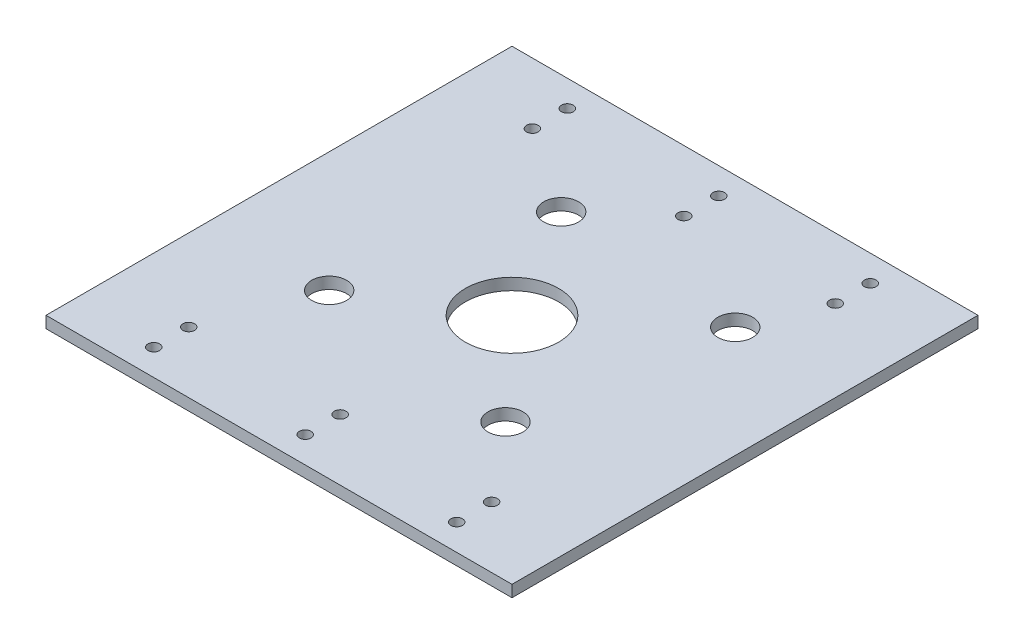
ISO-10303-21;
HEADER;
FILE_DESCRIPTION(('STEP AP214'),'2;1');
FILE_NAME('part.step','',(''),(''),'','','');
FILE_SCHEMA(('AUTOMOTIVE_DESIGN { 1 0 10303 214 1 1 1 1 }'));
ENDSEC;
DATA;
#1=APPLICATION_CONTEXT('core data for automotive mechanical design processes');
#2=APPLICATION_PROTOCOL_DEFINITION('international standard','automotive_design',2000,#1);
#3=PRODUCT_CONTEXT('',#1,'mechanical');
#4=PRODUCT('Part','Part','',(#3));
#5=PRODUCT_RELATED_PRODUCT_CATEGORY('part','',(#4));
#6=PRODUCT_DEFINITION_FORMATION('','',#4);
#7=PRODUCT_DEFINITION_CONTEXT('part definition',#1,'design');
#8=PRODUCT_DEFINITION('design','',#6,#7);
#9=PRODUCT_DEFINITION_SHAPE('','',#8);
#10=(LENGTH_UNIT() NAMED_UNIT(*) SI_UNIT(.MILLI.,.METRE.));
#11=(NAMED_UNIT(*) PLANE_ANGLE_UNIT() SI_UNIT($,.RADIAN.));
#12=(NAMED_UNIT(*) SI_UNIT($,.STERADIAN.) SOLID_ANGLE_UNIT());
#13=UNCERTAINTY_MEASURE_WITH_UNIT(LENGTH_MEASURE(1.E-05),#10,'distance_accuracy_value','');
#14=(GEOMETRIC_REPRESENTATION_CONTEXT(3) GLOBAL_UNCERTAINTY_ASSIGNED_CONTEXT((#13)) GLOBAL_UNIT_ASSIGNED_CONTEXT((#10,
#11,#12)) REPRESENTATION_CONTEXT('',''));
#15=CARTESIAN_POINT('',(0.,0.,0.));
#16=DIRECTION('',(0.,0.,1.));
#17=DIRECTION('',(1.,0.,0.));
#18=AXIS2_PLACEMENT_3D('',#15,#16,#17);
#19=CARTESIAN_POINT('',(0.,5.,0.));
#20=DIRECTION('',(0.,-1.,0.));
#21=DIRECTION('',(0.,0.,-1.));
#22=AXIS2_PLACEMENT_3D('',#19,#20,#21);
#23=PLANE('',#22);
#24=CARTESIAN_POINT('',(52.3820984976055,5.,-43.4338008732431));
#25=DIRECTION('',(0.,1.,0.));
#26=DIRECTION('',(0.,0.,1.));
#27=AXIS2_PLACEMENT_3D('',#24,#25,#26);
#28=CIRCLE('',#27,7.5);
#29=CARTESIAN_POINT('',(52.3820984976055,5.,-35.9338008732431));
#30=VERTEX_POINT('',#29);
#31=EDGE_CURVE('E205',#30,#30,#28,.T.);
#32=ORIENTED_EDGE('',*,*,#31,.F.);
#33=EDGE_LOOP('',(#32));
#34=FACE_BOUND('',#33,.T.);
#35=CARTESIAN_POINT('',(38.2325758203522,5.,41.0200772893711));
#36=DIRECTION('',(0.,1.,0.));
#37=DIRECTION('',(0.,0.,1.));
#38=AXIS2_PLACEMENT_3D('',#35,#36,#37);
#39=CIRCLE('',#38,7.5);
#40=CARTESIAN_POINT('',(38.2325758203522,5.,48.5200772893711));
#41=VERTEX_POINT('',#40);
#42=EDGE_CURVE('E211',#41,#41,#39,.T.);
#43=ORIENTED_EDGE('',*,*,#42,.F.);
#44=EDGE_LOOP('',(#43));
#45=FACE_BOUND('',#44,.T.);
#46=CARTESIAN_POINT('',(-48.5006940773205,5.,29.961353007127));
#47=DIRECTION('',(0.,1.,0.));
#48=DIRECTION('',(0.,0.,1.));
#49=AXIS2_PLACEMENT_3D('',#46,#47,#48);
#50=CIRCLE('',#49,7.5);
#51=CARTESIAN_POINT('',(-48.5006940773205,5.,37.461353007127));
#52=VERTEX_POINT('',#51);
#53=EDGE_CURVE('E199',#52,#52,#50,.T.);
#54=ORIENTED_EDGE('',*,*,#53,.F.);
#55=EDGE_LOOP('',(#54));
#56=FACE_BOUND('',#55,.T.);
#57=CARTESIAN_POINT('',(-27.8897953175984,5.,-49.0019741166008));
#58=DIRECTION('',(0.,1.,0.));
#59=DIRECTION('',(0.,0.,1.));
#60=AXIS2_PLACEMENT_3D('',#57,#58,#59);
#61=CIRCLE('',#60,7.5);
#62=CARTESIAN_POINT('',(-27.8897953175984,5.,-41.5019741166008));
#63=VERTEX_POINT('',#62);
#64=EDGE_CURVE('E196',#63,#63,#61,.T.);
#65=ORIENTED_EDGE('',*,*,#64,.F.);
#66=EDGE_LOOP('',(#65));
#67=FACE_BOUND('',#66,.T.);
#68=CARTESIAN_POINT('',(65.,5.,-88.75));
#69=DIRECTION('',(0.,1.,0.));
#70=DIRECTION('',(0.,0.,1.));
#71=AXIS2_PLACEMENT_3D('',#68,#69,#70);
#72=CIRCLE('',#71,2.50000000000001);
#73=CARTESIAN_POINT('',(65.,5.,-86.25));
#74=VERTEX_POINT('',#73);
#75=EDGE_CURVE('E166',#74,#74,#72,.T.);
#76=ORIENTED_EDGE('',*,*,#75,.F.);
#77=EDGE_LOOP('',(#76));
#78=FACE_BOUND('',#77,.T.);
#79=CARTESIAN_POINT('',(65.,5.,-73.75));
#80=DIRECTION('',(0.,1.,0.));
#81=DIRECTION('',(0.,0.,1.));
#82=AXIS2_PLACEMENT_3D('',#79,#80,#81);
#83=CIRCLE('',#82,2.50000000000001);
#84=CARTESIAN_POINT('',(65.,5.,-71.25));
#85=VERTEX_POINT('',#84);
#86=EDGE_CURVE('E185',#85,#85,#83,.T.);
#87=ORIENTED_EDGE('',*,*,#86,.F.);
#88=EDGE_LOOP('',(#87));
#89=FACE_BOUND('',#88,.T.);
#90=CARTESIAN_POINT('',(0.,5.,88.7500000000001));
#91=DIRECTION('',(0.,1.,0.));
#92=DIRECTION('',(0.,0.,1.));
#93=AXIS2_PLACEMENT_3D('',#90,#91,#92);
#94=CIRCLE('',#93,2.50000000000001);
#95=CARTESIAN_POINT('',(0.,5.,91.2500000000001));
#96=VERTEX_POINT('',#95);
#97=EDGE_CURVE('E173',#96,#96,#94,.T.);
#98=ORIENTED_EDGE('',*,*,#97,.F.);
#99=EDGE_LOOP('',(#98));
#100=FACE_BOUND('',#99,.T.);
#101=CARTESIAN_POINT('',(65.,5.,73.75));
#102=DIRECTION('',(0.,1.,0.));
#103=DIRECTION('',(0.,0.,1.));
#104=AXIS2_PLACEMENT_3D('',#101,#102,#103);
#105=CIRCLE('',#104,2.50000000000001);
#106=CARTESIAN_POINT('',(65.,5.,76.25));
#107=VERTEX_POINT('',#106);
#108=EDGE_CURVE('E178',#107,#107,#105,.T.);
#109=ORIENTED_EDGE('',*,*,#108,.F.);
#110=EDGE_LOOP('',(#109));
#111=FACE_BOUND('',#110,.T.);
#112=CARTESIAN_POINT('',(-65.,5.,88.7500000000001));
#113=DIRECTION('',(0.,1.,0.));
#114=DIRECTION('',(0.,0.,1.));
#115=AXIS2_PLACEMENT_3D('',#112,#113,#114);
#116=CIRCLE('',#115,2.50000000000001);
#117=CARTESIAN_POINT('',(-65.,5.,91.2500000000001));
#118=VERTEX_POINT('',#117);
#119=EDGE_CURVE('E149',#118,#118,#116,.T.);
#120=ORIENTED_EDGE('',*,*,#119,.F.);
#121=EDGE_LOOP('',(#120));
#122=FACE_BOUND('',#121,.T.);
#123=CARTESIAN_POINT('',(0.,5.,-88.75));
#124=DIRECTION('',(0.,1.,0.));
#125=DIRECTION('',(0.,0.,1.));
#126=AXIS2_PLACEMENT_3D('',#123,#124,#125);
#127=CIRCLE('',#126,2.50000000000001);
#128=CARTESIAN_POINT('',(0.,5.,-86.25));
#129=VERTEX_POINT('',#128);
#130=EDGE_CURVE('E142',#129,#129,#127,.T.);
#131=ORIENTED_EDGE('',*,*,#130,.F.);
#132=EDGE_LOOP('',(#131));
#133=FACE_BOUND('',#132,.T.);
#134=CARTESIAN_POINT('',(0.,5.,-73.75));
#135=DIRECTION('',(0.,1.,0.));
#136=DIRECTION('',(0.,0.,1.));
#137=AXIS2_PLACEMENT_3D('',#134,#135,#136);
#138=CIRCLE('',#137,2.50000000000001);
#139=CARTESIAN_POINT('',(0.,5.,-71.25));
#140=VERTEX_POINT('',#139);
#141=EDGE_CURVE('E161',#140,#140,#138,.T.);
#142=ORIENTED_EDGE('',*,*,#141,.F.);
#143=EDGE_LOOP('',(#142));
#144=FACE_BOUND('',#143,.T.);
#145=CARTESIAN_POINT('',(0.,5.,73.75));
#146=DIRECTION('',(0.,1.,0.));
#147=DIRECTION('',(0.,0.,1.));
#148=AXIS2_PLACEMENT_3D('',#145,#146,#147);
#149=CIRCLE('',#148,2.50000000000001);
#150=CARTESIAN_POINT('',(0.,5.,76.25));
#151=VERTEX_POINT('',#150);
#152=EDGE_CURVE('E154',#151,#151,#149,.T.);
#153=ORIENTED_EDGE('',*,*,#152,.F.);
#154=EDGE_LOOP('',(#153));
#155=FACE_BOUND('',#154,.T.);
#156=CARTESIAN_POINT('',(65.,5.,88.7500000000001));
#157=DIRECTION('',(0.,1.,0.));
#158=DIRECTION('',(0.,0.,1.));
#159=AXIS2_PLACEMENT_3D('',#156,#157,#158);
#160=CIRCLE('',#159,2.50000000000001);
#161=CARTESIAN_POINT('',(65.,5.,91.2500000000001));
#162=VERTEX_POINT('',#161);
#163=EDGE_CURVE('E190',#162,#162,#160,.T.);
#164=ORIENTED_EDGE('',*,*,#163,.F.);
#165=EDGE_LOOP('',(#164));
#166=FACE_BOUND('',#165,.T.);
#167=CARTESIAN_POINT('',(-65.,5.,73.75));
#168=DIRECTION('',(0.,1.,0.));
#169=DIRECTION('',(0.,0.,1.));
#170=AXIS2_PLACEMENT_3D('',#167,#168,#169);
#171=CIRCLE('',#170,2.50000000000001);
#172=CARTESIAN_POINT('',(-65.,5.,76.25));
#173=VERTEX_POINT('',#172);
#174=EDGE_CURVE('E136',#173,#173,#171,.T.);
#175=ORIENTED_EDGE('',*,*,#174,.F.);
#176=EDGE_LOOP('',(#175));
#177=FACE_BOUND('',#176,.T.);
#178=CARTESIAN_POINT('',(-65.,5.,-88.75));
#179=DIRECTION('',(0.,1.,0.));
#180=DIRECTION('',(0.,0.,1.));
#181=AXIS2_PLACEMENT_3D('',#178,#179,#180);
#182=CIRCLE('',#181,2.50000000000001);
#183=CARTESIAN_POINT('',(-65.,5.,-86.25));
#184=VERTEX_POINT('',#183);
#185=EDGE_CURVE('E131',#184,#184,#182,.T.);
#186=ORIENTED_EDGE('',*,*,#185,.F.);
#187=EDGE_LOOP('',(#186));
#188=FACE_BOUND('',#187,.T.);
#189=CARTESIAN_POINT('',(-65.,5.,-73.75));
#190=DIRECTION('',(0.,1.,0.));
#191=DIRECTION('',(0.,0.,1.));
#192=AXIS2_PLACEMENT_3D('',#189,#190,#191);
#193=CIRCLE('',#192,2.50000000000001);
#194=CARTESIAN_POINT('',(-65.,5.,-71.25));
#195=VERTEX_POINT('',#194);
#196=EDGE_CURVE('E124',#195,#195,#193,.T.);
#197=ORIENTED_EDGE('',*,*,#196,.F.);
#198=EDGE_LOOP('',(#197));
#199=FACE_BOUND('',#198,.T.);
#200=CARTESIAN_POINT('',(0.,5.,0.));
#201=DIRECTION('',(0.,1.,0.));
#202=DIRECTION('',(0.,0.,1.));
#203=AXIS2_PLACEMENT_3D('',#200,#201,#202);
#204=CIRCLE('',#203,20.);
#205=CARTESIAN_POINT('',(0.,5.,20.));
#206=VERTEX_POINT('',#205);
#207=EDGE_CURVE('E118',#206,#206,#204,.T.);
#208=ORIENTED_EDGE('',*,*,#207,.F.);
#209=EDGE_LOOP('',(#208));
#210=FACE_BOUND('',#209,.T.);
#211=DIRECTION('',(0.,0.,-1.));
#212=VECTOR('',#211,1.);
#213=CARTESIAN_POINT('',(100.,5.,100.));
#214=LINE('',#213,#212);
#215=CARTESIAN_POINT('',(100.,5.,100.));
#216=VERTEX_POINT('',#215);
#217=CARTESIAN_POINT('',(100.,5.,-100.));
#218=VERTEX_POINT('',#217);
#219=EDGE_CURVE('E92',#216,#218,#214,.T.);
#220=ORIENTED_EDGE('',*,*,#219,.T.);
#221=DIRECTION('',(-1.,0.,0.));
#222=VECTOR('',#221,1.);
#223=CARTESIAN_POINT('',(-100.,5.,-100.));
#224=LINE('',#223,#222);
#225=CARTESIAN_POINT('',(-100.,5.,-100.));
#226=VERTEX_POINT('',#225);
#227=EDGE_CURVE('E88',#218,#226,#224,.T.);
#228=ORIENTED_EDGE('',*,*,#227,.T.);
#229=DIRECTION('',(0.,0.,1.));
#230=VECTOR('',#229,1.);
#231=CARTESIAN_POINT('',(-100.,5.,100.));
#232=LINE('',#231,#230);
#233=CARTESIAN_POINT('',(-100.,5.,100.));
#234=VERTEX_POINT('',#233);
#235=EDGE_CURVE('E90',#226,#234,#232,.T.);
#236=ORIENTED_EDGE('',*,*,#235,.T.);
#237=DIRECTION('',(1.,0.,0.));
#238=VECTOR('',#237,1.);
#239=CARTESIAN_POINT('',(-100.,5.,100.));
#240=LINE('',#239,#238);
#241=EDGE_CURVE('E58',#234,#216,#240,.T.);
#242=ORIENTED_EDGE('',*,*,#241,.T.);
#243=EDGE_LOOP('',(#220,#228,#236,#242));
#244=FACE_BOUND('',#243,.T.);
#245=ADVANCED_FACE('F41',(#34,#45,#56,#67,#78,#89,#100,#111,#122,#133,#144,#155,#166,#177,#188,
#199,#210,#244),#23,.F.);
#246=CARTESIAN_POINT('',(100.,5.,100.));
#247=DIRECTION('',(-1.,0.,0.));
#248=DIRECTION('',(0.,0.,1.));
#249=AXIS2_PLACEMENT_3D('',#246,#247,#248);
#250=PLANE('',#249);
#251=DIRECTION('',(0.,0.,-1.));
#252=VECTOR('',#251,1.);
#253=CARTESIAN_POINT('',(100.,0.,100.));
#254=LINE('',#253,#252);
#255=CARTESIAN_POINT('',(100.,0.,100.));
#256=VERTEX_POINT('',#255);
#257=CARTESIAN_POINT('',(100.,0.,-100.));
#258=VERTEX_POINT('',#257);
#259=EDGE_CURVE('E104',#256,#258,#254,.T.);
#260=ORIENTED_EDGE('',*,*,#259,.T.);
#261=DIRECTION('',(0.,-1.,0.));
#262=VECTOR('',#261,1.);
#263=CARTESIAN_POINT('',(100.,5.,-100.));
#264=LINE('',#263,#262);
#265=EDGE_CURVE('E11',#218,#258,#264,.T.);
#266=ORIENTED_EDGE('',*,*,#265,.F.);
#267=ORIENTED_EDGE('',*,*,#219,.F.);
#268=DIRECTION('',(0.,-1.,0.));
#269=VECTOR('',#268,1.);
#270=CARTESIAN_POINT('',(100.,5.,100.));
#271=LINE('',#270,#269);
#272=EDGE_CURVE('E100',#216,#256,#271,.T.);
#273=ORIENTED_EDGE('',*,*,#272,.T.);
#274=EDGE_LOOP('',(#260,#266,#267,#273));
#275=FACE_BOUND('',#274,.T.);
#276=ADVANCED_FACE('F43',(#275),#250,.F.);
#277=CARTESIAN_POINT('',(-100.,5.,-100.));
#278=DIRECTION('',(0.,0.,1.));
#279=DIRECTION('',(1.,0.,0.));
#280=AXIS2_PLACEMENT_3D('',#277,#278,#279);
#281=PLANE('',#280);
#282=DIRECTION('',(-1.,0.,0.));
#283=VECTOR('',#282,1.);
#284=CARTESIAN_POINT('',(-100.,0.,-100.));
#285=LINE('',#284,#283);
#286=CARTESIAN_POINT('',(-100.,0.,-100.));
#287=VERTEX_POINT('',#286);
#288=EDGE_CURVE('E96',#258,#287,#285,.T.);
#289=ORIENTED_EDGE('',*,*,#288,.T.);
#290=DIRECTION('',(0.,-1.,0.));
#291=VECTOR('',#290,1.);
#292=CARTESIAN_POINT('',(-100.,5.,-100.));
#293=LINE('',#292,#291);
#294=EDGE_CURVE('E50',#226,#287,#293,.T.);
#295=ORIENTED_EDGE('',*,*,#294,.F.);
#296=ORIENTED_EDGE('',*,*,#227,.F.);
#297=ORIENTED_EDGE('',*,*,#265,.T.);
#298=EDGE_LOOP('',(#289,#295,#296,#297));
#299=FACE_BOUND('',#298,.T.);
#300=ADVANCED_FACE('F95',(#299),#281,.F.);
#301=CARTESIAN_POINT('',(-100.,5.,100.));
#302=DIRECTION('',(1.,0.,0.));
#303=DIRECTION('',(0.,0.,-1.));
#304=AXIS2_PLACEMENT_3D('',#301,#302,#303);
#305=PLANE('',#304);
#306=DIRECTION('',(0.,0.,1.));
#307=VECTOR('',#306,1.);
#308=CARTESIAN_POINT('',(-100.,0.,100.));
#309=LINE('',#308,#307);
#310=CARTESIAN_POINT('',(-100.,0.,100.));
#311=VERTEX_POINT('',#310);
#312=EDGE_CURVE('E75',#287,#311,#309,.T.);
#313=ORIENTED_EDGE('',*,*,#312,.T.);
#314=DIRECTION('',(0.,-1.,0.));
#315=VECTOR('',#314,1.);
#316=CARTESIAN_POINT('',(-100.,5.,100.));
#317=LINE('',#316,#315);
#318=EDGE_CURVE('E97',#234,#311,#317,.T.);
#319=ORIENTED_EDGE('',*,*,#318,.F.);
#320=ORIENTED_EDGE('',*,*,#235,.F.);
#321=ORIENTED_EDGE('',*,*,#294,.T.);
#322=EDGE_LOOP('',(#313,#319,#320,#321));
#323=FACE_BOUND('',#322,.T.);
#324=ADVANCED_FACE('F98',(#323),#305,.F.);
#325=CARTESIAN_POINT('',(-100.,5.,100.));
#326=DIRECTION('',(0.,0.,-1.));
#327=DIRECTION('',(-1.,0.,0.));
#328=AXIS2_PLACEMENT_3D('',#325,#326,#327);
#329=PLANE('',#328);
#330=DIRECTION('',(1.,0.,0.));
#331=VECTOR('',#330,1.);
#332=CARTESIAN_POINT('',(-100.,0.,100.));
#333=LINE('',#332,#331);
#334=EDGE_CURVE('E81',#311,#256,#333,.T.);
#335=ORIENTED_EDGE('',*,*,#334,.T.);
#336=ORIENTED_EDGE('',*,*,#272,.F.);
#337=ORIENTED_EDGE('',*,*,#241,.F.);
#338=ORIENTED_EDGE('',*,*,#318,.T.);
#339=EDGE_LOOP('',(#335,#336,#337,#338));
#340=FACE_BOUND('',#339,.T.);
#341=ADVANCED_FACE('F112',(#340),#329,.F.);
#342=CARTESIAN_POINT('',(0.,0.,0.));
#343=DIRECTION('',(0.,-1.,0.));
#344=DIRECTION('',(0.,0.,-1.));
#345=AXIS2_PLACEMENT_3D('',#342,#343,#344);
#346=PLANE('',#345);
#347=CARTESIAN_POINT('',(52.3820984976055,0.,-43.4338008732431));
#348=DIRECTION('',(0.,1.,0.));
#349=DIRECTION('',(0.,0.,1.));
#350=AXIS2_PLACEMENT_3D('',#347,#348,#349);
#351=CIRCLE('',#350,7.5);
#352=CARTESIAN_POINT('',(52.3820984976055,0.,-35.9338008732431));
#353=VERTEX_POINT('',#352);
#354=EDGE_CURVE('E202',#353,#353,#351,.T.);
#355=ORIENTED_EDGE('',*,*,#354,.T.);
#356=EDGE_LOOP('',(#355));
#357=FACE_BOUND('',#356,.T.);
#358=CARTESIAN_POINT('',(38.2325758203522,0.,41.0200772893711));
#359=DIRECTION('',(0.,1.,0.));
#360=DIRECTION('',(0.,0.,1.));
#361=AXIS2_PLACEMENT_3D('',#358,#359,#360);
#362=CIRCLE('',#361,7.5);
#363=CARTESIAN_POINT('',(38.2325758203522,0.,48.5200772893711));
#364=VERTEX_POINT('',#363);
#365=EDGE_CURVE('E208',#364,#364,#362,.T.);
#366=ORIENTED_EDGE('',*,*,#365,.T.);
#367=EDGE_LOOP('',(#366));
#368=FACE_BOUND('',#367,.T.);
#369=CARTESIAN_POINT('',(-48.5006940773205,0.,29.961353007127));
#370=DIRECTION('',(0.,1.,0.));
#371=DIRECTION('',(0.,0.,1.));
#372=AXIS2_PLACEMENT_3D('',#369,#370,#371);
#373=CIRCLE('',#372,7.5);
#374=CARTESIAN_POINT('',(-48.5006940773205,0.,37.461353007127));
#375=VERTEX_POINT('',#374);
#376=EDGE_CURVE('E214',#375,#375,#373,.T.);
#377=ORIENTED_EDGE('',*,*,#376,.T.);
#378=EDGE_LOOP('',(#377));
#379=FACE_BOUND('',#378,.T.);
#380=CARTESIAN_POINT('',(-27.8897953175984,0.,-49.0019741166008));
#381=DIRECTION('',(0.,1.,0.));
#382=DIRECTION('',(0.,0.,1.));
#383=AXIS2_PLACEMENT_3D('',#380,#381,#382);
#384=CIRCLE('',#383,7.5);
#385=CARTESIAN_POINT('',(-27.8897953175984,0.,-41.5019741166008));
#386=VERTEX_POINT('',#385);
#387=EDGE_CURVE('E193',#386,#386,#384,.T.);
#388=ORIENTED_EDGE('',*,*,#387,.T.);
#389=EDGE_LOOP('',(#388));
#390=FACE_BOUND('',#389,.T.);
#391=CARTESIAN_POINT('',(0.,0.,88.7500000000001));
#392=DIRECTION('',(0.,1.,0.));
#393=DIRECTION('',(0.,0.,1.));
#394=AXIS2_PLACEMENT_3D('',#391,#392,#393);
#395=CIRCLE('',#394,2.50000000000001);
#396=CARTESIAN_POINT('',(0.,0.,91.2500000000001));
#397=VERTEX_POINT('',#396);
#398=EDGE_CURVE('E158',#397,#397,#395,.T.);
#399=ORIENTED_EDGE('',*,*,#398,.T.);
#400=EDGE_LOOP('',(#399));
#401=FACE_BOUND('',#400,.T.);
#402=CARTESIAN_POINT('',(65.,0.,-88.75));
#403=DIRECTION('',(0.,1.,0.));
#404=DIRECTION('',(0.,0.,1.));
#405=AXIS2_PLACEMENT_3D('',#402,#403,#404);
#406=CIRCLE('',#405,2.50000000000001);
#407=CARTESIAN_POINT('',(65.,0.,-86.25));
#408=VERTEX_POINT('',#407);
#409=EDGE_CURVE('E169',#408,#408,#406,.T.);
#410=ORIENTED_EDGE('',*,*,#409,.T.);
#411=EDGE_LOOP('',(#410));
#412=FACE_BOUND('',#411,.T.);
#413=CARTESIAN_POINT('',(65.,0.,-73.75));
#414=DIRECTION('',(0.,1.,0.));
#415=DIRECTION('',(0.,0.,1.));
#416=AXIS2_PLACEMENT_3D('',#413,#414,#415);
#417=CIRCLE('',#416,2.50000000000001);
#418=CARTESIAN_POINT('',(65.,0.,-71.25));
#419=VERTEX_POINT('',#418);
#420=EDGE_CURVE('E170',#419,#419,#417,.T.);
#421=ORIENTED_EDGE('',*,*,#420,.T.);
#422=EDGE_LOOP('',(#421));
#423=FACE_BOUND('',#422,.T.);
#424=CARTESIAN_POINT('',(65.,0.,73.75));
#425=DIRECTION('',(0.,1.,0.));
#426=DIRECTION('',(0.,0.,1.));
#427=AXIS2_PLACEMENT_3D('',#424,#425,#426);
#428=CIRCLE('',#427,2.50000000000001);
#429=CARTESIAN_POINT('',(65.,0.,76.25));
#430=VERTEX_POINT('',#429);
#431=EDGE_CURVE('E181',#430,#430,#428,.T.);
#432=ORIENTED_EDGE('',*,*,#431,.T.);
#433=EDGE_LOOP('',(#432));
#434=FACE_BOUND('',#433,.T.);
#435=CARTESIAN_POINT('',(-65.,0.,88.7500000000001));
#436=DIRECTION('',(0.,1.,0.));
#437=DIRECTION('',(0.,0.,1.));
#438=AXIS2_PLACEMENT_3D('',#435,#436,#437);
#439=CIRCLE('',#438,2.50000000000001);
#440=CARTESIAN_POINT('',(-65.,0.,91.2500000000001));
#441=VERTEX_POINT('',#440);
#442=EDGE_CURVE('E139',#441,#441,#439,.T.);
#443=ORIENTED_EDGE('',*,*,#442,.T.);
#444=EDGE_LOOP('',(#443));
#445=FACE_BOUND('',#444,.T.);
#446=CARTESIAN_POINT('',(0.,0.,-88.75));
#447=DIRECTION('',(0.,1.,0.));
#448=DIRECTION('',(0.,0.,1.));
#449=AXIS2_PLACEMENT_3D('',#446,#447,#448);
#450=CIRCLE('',#449,2.50000000000001);
#451=CARTESIAN_POINT('',(0.,0.,-86.25));
#452=VERTEX_POINT('',#451);
#453=EDGE_CURVE('E145',#452,#452,#450,.T.);
#454=ORIENTED_EDGE('',*,*,#453,.T.);
#455=EDGE_LOOP('',(#454));
#456=FACE_BOUND('',#455,.T.);
#457=CARTESIAN_POINT('',(0.,0.,-73.75));
#458=DIRECTION('',(0.,1.,0.));
#459=DIRECTION('',(0.,0.,1.));
#460=AXIS2_PLACEMENT_3D('',#457,#458,#459);
#461=CIRCLE('',#460,2.50000000000001);
#462=CARTESIAN_POINT('',(0.,0.,-71.25));
#463=VERTEX_POINT('',#462);
#464=EDGE_CURVE('E146',#463,#463,#461,.T.);
#465=ORIENTED_EDGE('',*,*,#464,.T.);
#466=EDGE_LOOP('',(#465));
#467=FACE_BOUND('',#466,.T.);
#468=CARTESIAN_POINT('',(0.,0.,73.75));
#469=DIRECTION('',(0.,1.,0.));
#470=DIRECTION('',(0.,0.,1.));
#471=AXIS2_PLACEMENT_3D('',#468,#469,#470);
#472=CIRCLE('',#471,2.50000000000001);
#473=CARTESIAN_POINT('',(0.,0.,76.25));
#474=VERTEX_POINT('',#473);
#475=EDGE_CURVE('E157',#474,#474,#472,.T.);
#476=ORIENTED_EDGE('',*,*,#475,.T.);
#477=EDGE_LOOP('',(#476));
#478=FACE_BOUND('',#477,.T.);
#479=CARTESIAN_POINT('',(65.,0.,88.7500000000001));
#480=DIRECTION('',(0.,1.,0.));
#481=DIRECTION('',(0.,0.,1.));
#482=AXIS2_PLACEMENT_3D('',#479,#480,#481);
#483=CIRCLE('',#482,2.50000000000001);
#484=CARTESIAN_POINT('',(65.,0.,91.2500000000001));
#485=VERTEX_POINT('',#484);
#486=EDGE_CURVE('E182',#485,#485,#483,.T.);
#487=ORIENTED_EDGE('',*,*,#486,.T.);
#488=EDGE_LOOP('',(#487));
#489=FACE_BOUND('',#488,.T.);
#490=CARTESIAN_POINT('',(-65.,0.,73.75));
#491=DIRECTION('',(0.,1.,0.));
#492=DIRECTION('',(0.,0.,1.));
#493=AXIS2_PLACEMENT_3D('',#490,#491,#492);
#494=CIRCLE('',#493,2.50000000000001);
#495=CARTESIAN_POINT('',(-65.,0.,76.25));
#496=VERTEX_POINT('',#495);
#497=EDGE_CURVE('E128',#496,#496,#494,.T.);
#498=ORIENTED_EDGE('',*,*,#497,.T.);
#499=EDGE_LOOP('',(#498));
#500=FACE_BOUND('',#499,.T.);
#501=CARTESIAN_POINT('',(-65.,0.,-88.75));
#502=DIRECTION('',(0.,1.,0.));
#503=DIRECTION('',(0.,0.,1.));
#504=AXIS2_PLACEMENT_3D('',#501,#502,#503);
#505=CIRCLE('',#504,2.50000000000001);
#506=CARTESIAN_POINT('',(-65.,0.,-86.25));
#507=VERTEX_POINT('',#506);
#508=EDGE_CURVE('E121',#507,#507,#505,.T.);
#509=ORIENTED_EDGE('',*,*,#508,.T.);
#510=EDGE_LOOP('',(#509));
#511=FACE_BOUND('',#510,.T.);
#512=CARTESIAN_POINT('',(-65.,0.,-73.75));
#513=DIRECTION('',(0.,1.,0.));
#514=DIRECTION('',(0.,0.,1.));
#515=AXIS2_PLACEMENT_3D('',#512,#513,#514);
#516=CIRCLE('',#515,2.50000000000001);
#517=CARTESIAN_POINT('',(-65.,0.,-71.25));
#518=VERTEX_POINT('',#517);
#519=EDGE_CURVE('E127',#518,#518,#516,.T.);
#520=ORIENTED_EDGE('',*,*,#519,.T.);
#521=EDGE_LOOP('',(#520));
#522=FACE_BOUND('',#521,.T.);
#523=CARTESIAN_POINT('',(0.,0.,0.));
#524=DIRECTION('',(0.,1.,0.));
#525=DIRECTION('',(0.,0.,1.));
#526=AXIS2_PLACEMENT_3D('',#523,#524,#525);
#527=CIRCLE('',#526,20.);
#528=CARTESIAN_POINT('',(0.,0.,20.));
#529=VERTEX_POINT('',#528);
#530=EDGE_CURVE('E107',#529,#529,#527,.T.);
#531=ORIENTED_EDGE('',*,*,#530,.T.);
#532=EDGE_LOOP('',(#531));
#533=FACE_BOUND('',#532,.T.);
#534=ORIENTED_EDGE('',*,*,#259,.F.);
#535=ORIENTED_EDGE('',*,*,#334,.F.);
#536=ORIENTED_EDGE('',*,*,#312,.F.);
#537=ORIENTED_EDGE('',*,*,#288,.F.);
#538=EDGE_LOOP('',(#534,#535,#536,#537));
#539=FACE_BOUND('',#538,.T.);
#540=ADVANCED_FACE('F115',(#357,#368,#379,#390,#401,#412,#423,#434,#445,#456,#467,#478,#489,
#500,#511,#522,#533,#539),#346,.T.);
#541=CARTESIAN_POINT('',(0.,0.,0.));
#542=DIRECTION('',(0.,1.,0.));
#543=DIRECTION('',(0.,0.,1.));
#544=AXIS2_PLACEMENT_3D('',#541,#542,#543);
#545=CYLINDRICAL_SURFACE('',#544,20.);
#546=ORIENTED_EDGE('',*,*,#530,.F.);
#547=EDGE_LOOP('',(#546));
#548=FACE_BOUND('',#547,.T.);
#549=ORIENTED_EDGE('',*,*,#207,.T.);
#550=EDGE_LOOP('',(#549));
#551=FACE_BOUND('',#550,.T.);
#552=ADVANCED_FACE('F254',(#548,#551),#545,.F.);
#553=CARTESIAN_POINT('',(-65.,0.,-73.75));
#554=DIRECTION('',(0.,1.,0.));
#555=DIRECTION('',(0.,0.,1.));
#556=AXIS2_PLACEMENT_3D('',#553,#554,#555);
#557=CYLINDRICAL_SURFACE('',#556,2.50000000000001);
#558=ORIENTED_EDGE('',*,*,#519,.F.);
#559=EDGE_LOOP('',(#558));
#560=FACE_BOUND('',#559,.T.);
#561=ORIENTED_EDGE('',*,*,#196,.T.);
#562=EDGE_LOOP('',(#561));
#563=FACE_BOUND('',#562,.T.);
#564=ADVANCED_FACE('F256',(#560,#563),#557,.F.);
#565=CARTESIAN_POINT('',(-65.,0.,-88.75));
#566=DIRECTION('',(0.,1.,0.));
#567=DIRECTION('',(0.,0.,1.));
#568=AXIS2_PLACEMENT_3D('',#565,#566,#567);
#569=CYLINDRICAL_SURFACE('',#568,2.50000000000001);
#570=ORIENTED_EDGE('',*,*,#508,.F.);
#571=EDGE_LOOP('',(#570));
#572=FACE_BOUND('',#571,.T.);
#573=ORIENTED_EDGE('',*,*,#185,.T.);
#574=EDGE_LOOP('',(#573));
#575=FACE_BOUND('',#574,.T.);
#576=ADVANCED_FACE('F263',(#572,#575),#569,.F.);
#577=CARTESIAN_POINT('',(-65.,0.,73.75));
#578=DIRECTION('',(0.,1.,0.));
#579=DIRECTION('',(0.,0.,1.));
#580=AXIS2_PLACEMENT_3D('',#577,#578,#579);
#581=CYLINDRICAL_SURFACE('',#580,2.50000000000001);
#582=ORIENTED_EDGE('',*,*,#497,.F.);
#583=EDGE_LOOP('',(#582));
#584=FACE_BOUND('',#583,.T.);
#585=ORIENTED_EDGE('',*,*,#174,.T.);
#586=EDGE_LOOP('',(#585));
#587=FACE_BOUND('',#586,.T.);
#588=ADVANCED_FACE('F330',(#584,#587),#581,.F.);
#589=CARTESIAN_POINT('',(65.,0.,88.7500000000001));
#590=DIRECTION('',(0.,1.,0.));
#591=DIRECTION('',(0.,0.,1.));
#592=AXIS2_PLACEMENT_3D('',#589,#590,#591);
#593=CYLINDRICAL_SURFACE('',#592,2.50000000000001);
#594=ORIENTED_EDGE('',*,*,#486,.F.);
#595=EDGE_LOOP('',(#594));
#596=FACE_BOUND('',#595,.T.);
#597=ORIENTED_EDGE('',*,*,#163,.T.);
#598=EDGE_LOOP('',(#597));
#599=FACE_BOUND('',#598,.T.);
#600=ADVANCED_FACE('F339',(#596,#599),#593,.F.);
#601=CARTESIAN_POINT('',(0.,0.,73.75));
#602=DIRECTION('',(0.,1.,0.));
#603=DIRECTION('',(0.,0.,1.));
#604=AXIS2_PLACEMENT_3D('',#601,#602,#603);
#605=CYLINDRICAL_SURFACE('',#604,2.50000000000001);
#606=ORIENTED_EDGE('',*,*,#475,.F.);
#607=EDGE_LOOP('',(#606));
#608=FACE_BOUND('',#607,.T.);
#609=ORIENTED_EDGE('',*,*,#152,.T.);
#610=EDGE_LOOP('',(#609));
#611=FACE_BOUND('',#610,.T.);
#612=ADVANCED_FACE('F349',(#608,#611),#605,.F.);
#613=CARTESIAN_POINT('',(0.,0.,-73.75));
#614=DIRECTION('',(0.,1.,0.));
#615=DIRECTION('',(0.,0.,1.));
#616=AXIS2_PLACEMENT_3D('',#613,#614,#615);
#617=CYLINDRICAL_SURFACE('',#616,2.50000000000001);
#618=ORIENTED_EDGE('',*,*,#464,.F.);
#619=EDGE_LOOP('',(#618));
#620=FACE_BOUND('',#619,.T.);
#621=ORIENTED_EDGE('',*,*,#141,.T.);
#622=EDGE_LOOP('',(#621));
#623=FACE_BOUND('',#622,.T.);
#624=ADVANCED_FACE('F359',(#620,#623),#617,.F.);
#625=CARTESIAN_POINT('',(0.,0.,-88.75));
#626=DIRECTION('',(0.,1.,0.));
#627=DIRECTION('',(0.,0.,1.));
#628=AXIS2_PLACEMENT_3D('',#625,#626,#627);
#629=CYLINDRICAL_SURFACE('',#628,2.50000000000001);
#630=ORIENTED_EDGE('',*,*,#453,.F.);
#631=EDGE_LOOP('',(#630));
#632=FACE_BOUND('',#631,.T.);
#633=ORIENTED_EDGE('',*,*,#130,.T.);
#634=EDGE_LOOP('',(#633));
#635=FACE_BOUND('',#634,.T.);
#636=ADVANCED_FACE('F369',(#632,#635),#629,.F.);
#637=CARTESIAN_POINT('',(-65.,0.,88.7500000000001));
#638=DIRECTION('',(0.,1.,0.));
#639=DIRECTION('',(0.,0.,1.));
#640=AXIS2_PLACEMENT_3D('',#637,#638,#639);
#641=CYLINDRICAL_SURFACE('',#640,2.50000000000001);
#642=ORIENTED_EDGE('',*,*,#442,.F.);
#643=EDGE_LOOP('',(#642));
#644=FACE_BOUND('',#643,.T.);
#645=ORIENTED_EDGE('',*,*,#119,.T.);
#646=EDGE_LOOP('',(#645));
#647=FACE_BOUND('',#646,.T.);
#648=ADVANCED_FACE('F379',(#644,#647),#641,.F.);
#649=CARTESIAN_POINT('',(65.,0.,73.75));
#650=DIRECTION('',(0.,1.,0.));
#651=DIRECTION('',(0.,0.,1.));
#652=AXIS2_PLACEMENT_3D('',#649,#650,#651);
#653=CYLINDRICAL_SURFACE('',#652,2.50000000000001);
#654=ORIENTED_EDGE('',*,*,#431,.F.);
#655=EDGE_LOOP('',(#654));
#656=FACE_BOUND('',#655,.T.);
#657=ORIENTED_EDGE('',*,*,#108,.T.);
#658=EDGE_LOOP('',(#657));
#659=FACE_BOUND('',#658,.T.);
#660=ADVANCED_FACE('F389',(#656,#659),#653,.F.);
#661=CARTESIAN_POINT('',(65.,0.,-73.75));
#662=DIRECTION('',(0.,1.,0.));
#663=DIRECTION('',(0.,0.,1.));
#664=AXIS2_PLACEMENT_3D('',#661,#662,#663);
#665=CYLINDRICAL_SURFACE('',#664,2.50000000000001);
#666=ORIENTED_EDGE('',*,*,#420,.F.);
#667=EDGE_LOOP('',(#666));
#668=FACE_BOUND('',#667,.T.);
#669=ORIENTED_EDGE('',*,*,#86,.T.);
#670=EDGE_LOOP('',(#669));
#671=FACE_BOUND('',#670,.T.);
#672=ADVANCED_FACE('F399',(#668,#671),#665,.F.);
#673=CARTESIAN_POINT('',(65.,0.,-88.75));
#674=DIRECTION('',(0.,1.,0.));
#675=DIRECTION('',(0.,0.,1.));
#676=AXIS2_PLACEMENT_3D('',#673,#674,#675);
#677=CYLINDRICAL_SURFACE('',#676,2.50000000000001);
#678=ORIENTED_EDGE('',*,*,#409,.F.);
#679=EDGE_LOOP('',(#678));
#680=FACE_BOUND('',#679,.T.);
#681=ORIENTED_EDGE('',*,*,#75,.T.);
#682=EDGE_LOOP('',(#681));
#683=FACE_BOUND('',#682,.T.);
#684=ADVANCED_FACE('F410',(#680,#683),#677,.F.);
#685=CARTESIAN_POINT('',(0.,0.,88.7500000000001));
#686=DIRECTION('',(0.,1.,0.));
#687=DIRECTION('',(0.,0.,1.));
#688=AXIS2_PLACEMENT_3D('',#685,#686,#687);
#689=CYLINDRICAL_SURFACE('',#688,2.50000000000001);
#690=ORIENTED_EDGE('',*,*,#398,.F.);
#691=EDGE_LOOP('',(#690));
#692=FACE_BOUND('',#691,.T.);
#693=ORIENTED_EDGE('',*,*,#97,.T.);
#694=EDGE_LOOP('',(#693));
#695=FACE_BOUND('',#694,.T.);
#696=ADVANCED_FACE('F420',(#692,#695),#689,.F.);
#697=CARTESIAN_POINT('',(-27.8897953175984,0.,-49.0019741166008));
#698=DIRECTION('',(0.,1.,0.));
#699=DIRECTION('',(0.,0.,1.));
#700=AXIS2_PLACEMENT_3D('',#697,#698,#699);
#701=CYLINDRICAL_SURFACE('',#700,7.5);
#702=ORIENTED_EDGE('',*,*,#387,.F.);
#703=EDGE_LOOP('',(#702));
#704=FACE_BOUND('',#703,.T.);
#705=ORIENTED_EDGE('',*,*,#64,.T.);
#706=EDGE_LOOP('',(#705));
#707=FACE_BOUND('',#706,.T.);
#708=ADVANCED_FACE('F429',(#704,#707),#701,.F.);
#709=CARTESIAN_POINT('',(-48.5006940773205,0.,29.961353007127));
#710=DIRECTION('',(0.,1.,0.));
#711=DIRECTION('',(0.,0.,1.));
#712=AXIS2_PLACEMENT_3D('',#709,#710,#711);
#713=CYLINDRICAL_SURFACE('',#712,7.5);
#714=ORIENTED_EDGE('',*,*,#376,.F.);
#715=EDGE_LOOP('',(#714));
#716=FACE_BOUND('',#715,.T.);
#717=ORIENTED_EDGE('',*,*,#53,.T.);
#718=EDGE_LOOP('',(#717));
#719=FACE_BOUND('',#718,.T.);
#720=ADVANCED_FACE('F220',(#716,#719),#713,.F.);
#721=CARTESIAN_POINT('',(38.2325758203522,0.,41.0200772893711));
#722=DIRECTION('',(0.,1.,0.));
#723=DIRECTION('',(0.,0.,1.));
#724=AXIS2_PLACEMENT_3D('',#721,#722,#723);
#725=CYLINDRICAL_SURFACE('',#724,7.5);
#726=ORIENTED_EDGE('',*,*,#365,.F.);
#727=EDGE_LOOP('',(#726));
#728=FACE_BOUND('',#727,.T.);
#729=ORIENTED_EDGE('',*,*,#42,.T.);
#730=EDGE_LOOP('',(#729));
#731=FACE_BOUND('',#730,.T.);
#732=ADVANCED_FACE('F451',(#728,#731),#725,.F.);
#733=CARTESIAN_POINT('',(52.3820984976055,0.,-43.4338008732431));
#734=DIRECTION('',(0.,1.,0.));
#735=DIRECTION('',(0.,0.,1.));
#736=AXIS2_PLACEMENT_3D('',#733,#734,#735);
#737=CYLINDRICAL_SURFACE('',#736,7.5);
#738=ORIENTED_EDGE('',*,*,#354,.F.);
#739=EDGE_LOOP('',(#738));
#740=FACE_BOUND('',#739,.T.);
#741=ORIENTED_EDGE('',*,*,#31,.T.);
#742=EDGE_LOOP('',(#741));
#743=FACE_BOUND('',#742,.T.);
#744=ADVANCED_FACE('F461',(#740,#743),#737,.F.);
#745=CLOSED_SHELL('',(#245,#276,#300,#324,#341,#540,#552,#564,#576,#588,#600,#612,#624,#636,
#648,#660,#672,#684,#696,#708,#720,#732,#744));
#746=MANIFOLD_SOLID_BREP('B2',#745);
#747=ADVANCED_BREP_SHAPE_REPRESENTATION('',(#18,#746),#14);
#748=SHAPE_DEFINITION_REPRESENTATION(#9,#747);
ENDSEC;
END-ISO-10303-21;
